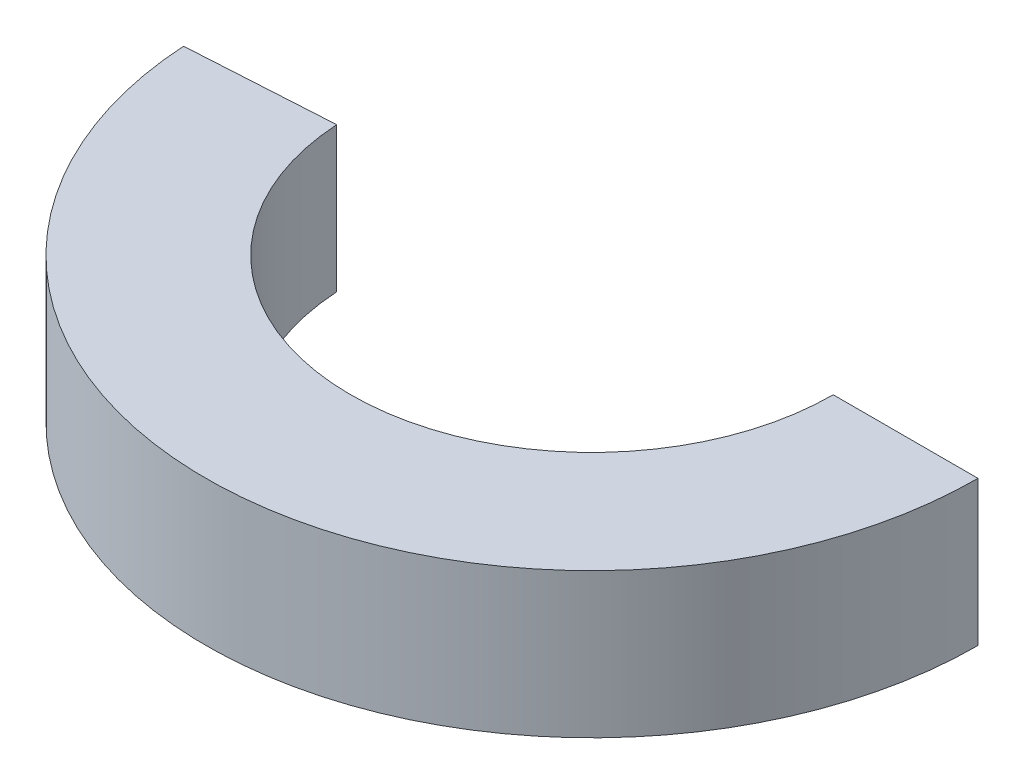
ISO-10303-21;
HEADER;
FILE_DESCRIPTION(('STEP AP214'),'2;1');
FILE_NAME('part.step','',(''),(''),'','','');
FILE_SCHEMA(('AUTOMOTIVE_DESIGN { 1 0 10303 214 1 1 1 1 }'));
ENDSEC;
DATA;
#1=APPLICATION_CONTEXT('core data for automotive mechanical design processes');
#2=APPLICATION_PROTOCOL_DEFINITION('international standard','automotive_design',2000,#1);
#3=PRODUCT_CONTEXT('',#1,'mechanical');
#4=PRODUCT('Part','Part','',(#3));
#5=PRODUCT_RELATED_PRODUCT_CATEGORY('part','',(#4));
#6=PRODUCT_DEFINITION_FORMATION('','',#4);
#7=PRODUCT_DEFINITION_CONTEXT('part definition',#1,'design');
#8=PRODUCT_DEFINITION('design','',#6,#7);
#9=PRODUCT_DEFINITION_SHAPE('','',#8);
#10=(LENGTH_UNIT() NAMED_UNIT(*) SI_UNIT(.MILLI.,.METRE.));
#11=(NAMED_UNIT(*) PLANE_ANGLE_UNIT() SI_UNIT($,.RADIAN.));
#12=(NAMED_UNIT(*) SI_UNIT($,.STERADIAN.) SOLID_ANGLE_UNIT());
#13=UNCERTAINTY_MEASURE_WITH_UNIT(LENGTH_MEASURE(1.E-05),#10,'distance_accuracy_value','');
#14=(GEOMETRIC_REPRESENTATION_CONTEXT(3) GLOBAL_UNCERTAINTY_ASSIGNED_CONTEXT((#13)) GLOBAL_UNIT_ASSIGNED_CONTEXT((#10,
#11,#12)) REPRESENTATION_CONTEXT('',''));
#15=CARTESIAN_POINT('',(0.,0.,0.));
#16=DIRECTION('',(0.,0.,1.));
#17=DIRECTION('',(1.,0.,0.));
#18=AXIS2_PLACEMENT_3D('',#15,#16,#17);
#19=CARTESIAN_POINT('',(0.,15.,0.));
#20=DIRECTION('',(-0.0594805983890085,0.,-0.998229461804893));
#21=DIRECTION('',(-0.998229461804893,0.,0.0594805983890085));
#22=AXIS2_PLACEMENT_3D('',#19,#20,#21);
#23=PLANE('',#22);
#24=DIRECTION('',(0.998229461804893,0.,-0.0594805983890085));
#25=VECTOR('',#24,1.);
#26=CARTESIAN_POINT('',(0.,0.,0.));
#27=LINE('',#26,#25);
#28=CARTESIAN_POINT('',(-39.9291784721957,0.,2.37922393556034));
#29=VERTEX_POINT('',#28);
#30=CARTESIAN_POINT('',(-24.9557365451223,0.,1.48701495972521));
#31=VERTEX_POINT('',#30);
#32=EDGE_CURVE('E113',#29,#31,#27,.T.);
#33=ORIENTED_EDGE('',*,*,#32,.F.);
#34=DIRECTION('',(0.,-1.,0.));
#35=VECTOR('',#34,1.);
#36=CARTESIAN_POINT('',(-39.9291784721957,15.,2.37922393556034));
#37=LINE('',#36,#35);
#38=CARTESIAN_POINT('',(-39.9291784721957,15.,2.37922393556034));
#39=VERTEX_POINT('',#38);
#40=EDGE_CURVE('E11',#39,#29,#37,.T.);
#41=ORIENTED_EDGE('',*,*,#40,.F.);
#42=DIRECTION('',(0.998229461804893,0.,-0.0594805983890085));
#43=VECTOR('',#42,1.);
#44=CARTESIAN_POINT('',(0.,15.,0.));
#45=LINE('',#44,#43);
#46=CARTESIAN_POINT('',(-24.9557365451223,15.,1.48701495972521));
#47=VERTEX_POINT('',#46);
#48=EDGE_CURVE('E94',#39,#47,#45,.T.);
#49=ORIENTED_EDGE('',*,*,#48,.T.);
#50=DIRECTION('',(0.,-1.,0.));
#51=VECTOR('',#50,1.);
#52=CARTESIAN_POINT('',(-24.9557365451223,15.,1.48701495972521));
#53=LINE('',#52,#51);
#54=EDGE_CURVE('E62',#47,#31,#53,.T.);
#55=ORIENTED_EDGE('',*,*,#54,.T.);
#56=EDGE_LOOP('',(#33,#41,#49,#55));
#57=FACE_BOUND('',#56,.T.);
#58=ADVANCED_FACE('F45',(#57),#23,.T.);
#59=CARTESIAN_POINT('',(0.,15.,0.));
#60=DIRECTION('',(0.,-1.,0.));
#61=DIRECTION('',(0.,0.,-1.));
#62=AXIS2_PLACEMENT_3D('',#59,#60,#61);
#63=CYLINDRICAL_SURFACE('',#62,40.);
#64=CARTESIAN_POINT('',(0.,0.,0.));
#65=DIRECTION('',(0.,1.,0.));
#66=DIRECTION('',(0.,0.,1.));
#67=AXIS2_PLACEMENT_3D('',#64,#65,#66);
#68=CIRCLE('',#67,40.);
#69=CARTESIAN_POINT('',(40.,0.,0.));
#70=VERTEX_POINT('',#69);
#71=EDGE_CURVE('E101',#29,#70,#68,.T.);
#72=ORIENTED_EDGE('',*,*,#71,.T.);
#73=DIRECTION('',(0.,-1.,0.));
#74=VECTOR('',#73,1.);
#75=CARTESIAN_POINT('',(40.,15.,0.));
#76=LINE('',#75,#74);
#77=CARTESIAN_POINT('',(40.,15.,0.));
#78=VERTEX_POINT('',#77);
#79=EDGE_CURVE('E54',#78,#70,#76,.T.);
#80=ORIENTED_EDGE('',*,*,#79,.F.);
#81=CARTESIAN_POINT('',(0.,15.,0.));
#82=DIRECTION('',(0.,1.,0.));
#83=DIRECTION('',(0.,0.,1.));
#84=AXIS2_PLACEMENT_3D('',#81,#82,#83);
#85=CIRCLE('',#84,40.);
#86=EDGE_CURVE('E88',#39,#78,#85,.T.);
#87=ORIENTED_EDGE('',*,*,#86,.F.);
#88=ORIENTED_EDGE('',*,*,#40,.T.);
#89=EDGE_LOOP('',(#72,#80,#87,#88));
#90=FACE_BOUND('',#89,.T.);
#91=ADVANCED_FACE('F99',(#90),#63,.T.);
#92=CARTESIAN_POINT('',(0.,15.,0.));
#93=DIRECTION('',(0.,0.,-1.));
#94=DIRECTION('',(-1.,0.,0.));
#95=AXIS2_PLACEMENT_3D('',#92,#93,#94);
#96=PLANE('',#95);
#97=DIRECTION('',(1.,0.,0.));
#98=VECTOR('',#97,1.);
#99=CARTESIAN_POINT('',(0.,0.,0.));
#100=LINE('',#99,#98);
#101=CARTESIAN_POINT('',(25.,0.,0.));
#102=VERTEX_POINT('',#101);
#103=EDGE_CURVE('E118',#102,#70,#100,.T.);
#104=ORIENTED_EDGE('',*,*,#103,.F.);
#105=DIRECTION('',(0.,-1.,0.));
#106=VECTOR('',#105,1.);
#107=CARTESIAN_POINT('',(25.,15.,0.));
#108=LINE('',#107,#106);
#109=CARTESIAN_POINT('',(25.,15.,0.));
#110=VERTEX_POINT('',#109);
#111=EDGE_CURVE('E75',#110,#102,#108,.T.);
#112=ORIENTED_EDGE('',*,*,#111,.F.);
#113=DIRECTION('',(1.,0.,0.));
#114=VECTOR('',#113,1.);
#115=CARTESIAN_POINT('',(0.,15.,0.));
#116=LINE('',#115,#114);
#117=EDGE_CURVE('E93',#110,#78,#116,.T.);
#118=ORIENTED_EDGE('',*,*,#117,.T.);
#119=ORIENTED_EDGE('',*,*,#79,.T.);
#120=EDGE_LOOP('',(#104,#112,#118,#119));
#121=FACE_BOUND('',#120,.T.);
#122=ADVANCED_FACE('F105',(#121),#96,.T.);
#123=CARTESIAN_POINT('',(0.,15.,0.));
#124=DIRECTION('',(0.,-1.,0.));
#125=DIRECTION('',(0.,0.,-1.));
#126=AXIS2_PLACEMENT_3D('',#123,#124,#125);
#127=CYLINDRICAL_SURFACE('',#126,25.);
#128=CARTESIAN_POINT('',(0.,0.,0.));
#129=DIRECTION('',(0.,1.,0.));
#130=DIRECTION('',(0.,0.,1.));
#131=AXIS2_PLACEMENT_3D('',#128,#129,#130);
#132=CIRCLE('',#131,25.);
#133=EDGE_CURVE('E121',#31,#102,#132,.T.);
#134=ORIENTED_EDGE('',*,*,#133,.F.);
#135=ORIENTED_EDGE('',*,*,#54,.F.);
#136=CARTESIAN_POINT('',(0.,15.,0.));
#137=DIRECTION('',(0.,1.,0.));
#138=DIRECTION('',(0.,0.,1.));
#139=AXIS2_PLACEMENT_3D('',#136,#137,#138);
#140=CIRCLE('',#139,25.);
#141=EDGE_CURVE('E107',#47,#110,#140,.T.);
#142=ORIENTED_EDGE('',*,*,#141,.T.);
#143=ORIENTED_EDGE('',*,*,#111,.T.);
#144=EDGE_LOOP('',(#134,#135,#142,#143));
#145=FACE_BOUND('',#144,.T.);
#146=ADVANCED_FACE('F130',(#145),#127,.F.);
#147=CARTESIAN_POINT('',(0.,15.,0.));
#148=DIRECTION('',(0.,1.,0.));
#149=DIRECTION('',(0.,0.,1.));
#150=AXIS2_PLACEMENT_3D('',#147,#148,#149);
#151=PLANE('',#150);
#152=ORIENTED_EDGE('',*,*,#48,.F.);
#153=ORIENTED_EDGE('',*,*,#86,.T.);
#154=ORIENTED_EDGE('',*,*,#117,.F.);
#155=ORIENTED_EDGE('',*,*,#141,.F.);
#156=EDGE_LOOP('',(#152,#153,#154,#155));
#157=FACE_BOUND('',#156,.T.);
#158=ADVANCED_FACE('F90',(#157),#151,.T.);
#159=CARTESIAN_POINT('',(0.,0.,0.));
#160=DIRECTION('',(0.,1.,0.));
#161=DIRECTION('',(0.,0.,1.));
#162=AXIS2_PLACEMENT_3D('',#159,#160,#161);
#163=PLANE('',#162);
#164=ORIENTED_EDGE('',*,*,#32,.T.);
#165=ORIENTED_EDGE('',*,*,#133,.T.);
#166=ORIENTED_EDGE('',*,*,#103,.T.);
#167=ORIENTED_EDGE('',*,*,#71,.F.);
#168=EDGE_LOOP('',(#164,#165,#166,#167));
#169=FACE_BOUND('',#168,.T.);
#170=ADVANCED_FACE('F137',(#169),#163,.F.);
#171=CLOSED_SHELL('',(#58,#91,#122,#146,#158,#170));
#172=MANIFOLD_SOLID_BREP('B2',#171);
#173=ADVANCED_BREP_SHAPE_REPRESENTATION('',(#18,#172),#14);
#174=SHAPE_DEFINITION_REPRESENTATION(#9,#173);
ENDSEC;
END-ISO-10303-21;
